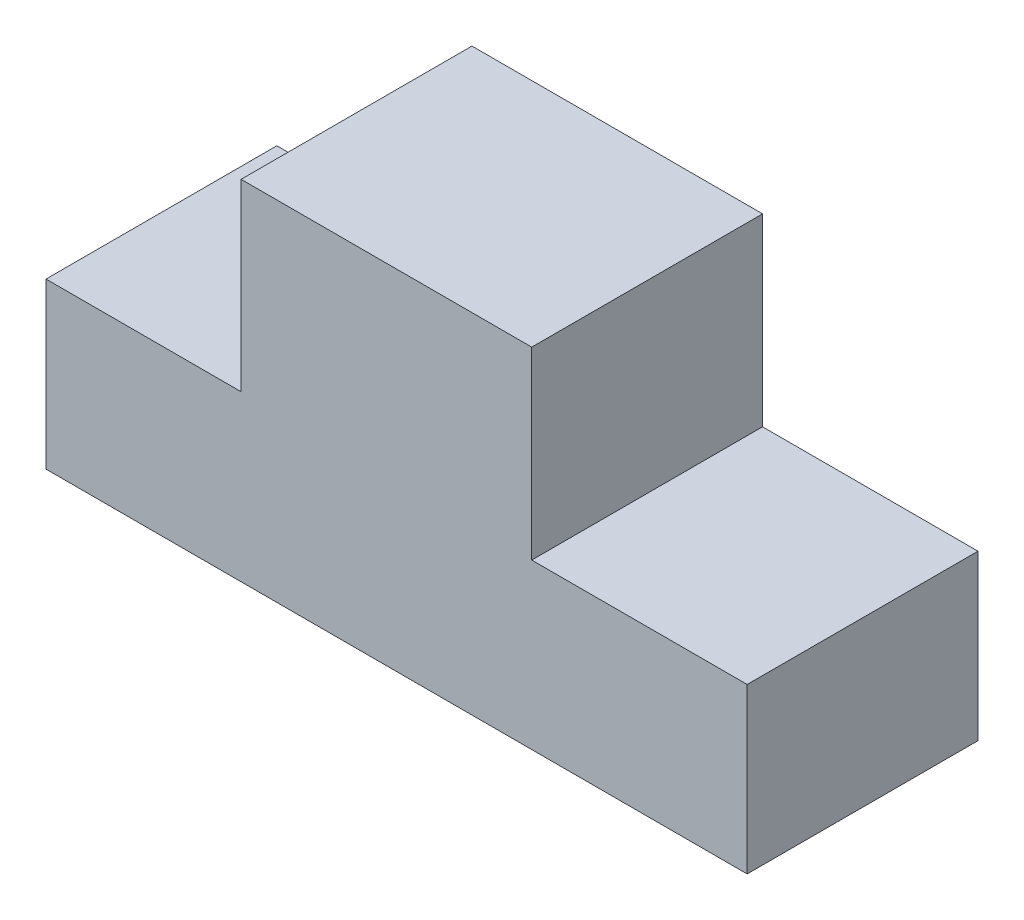
ISO-10303-21;
HEADER;
FILE_DESCRIPTION(('STEP AP214'),'2;1');
FILE_NAME('part.step','',(''),(''),'','','');
FILE_SCHEMA(('AUTOMOTIVE_DESIGN { 1 0 10303 214 1 1 1 1 }'));
ENDSEC;
DATA;
#1=APPLICATION_CONTEXT('core data for automotive mechanical design processes');
#2=APPLICATION_PROTOCOL_DEFINITION('international standard','automotive_design',2000,#1);
#3=PRODUCT_CONTEXT('',#1,'mechanical');
#4=PRODUCT('Part','Part','',(#3));
#5=PRODUCT_RELATED_PRODUCT_CATEGORY('part','',(#4));
#6=PRODUCT_DEFINITION_FORMATION('','',#4);
#7=PRODUCT_DEFINITION_CONTEXT('part definition',#1,'design');
#8=PRODUCT_DEFINITION('design','',#6,#7);
#9=PRODUCT_DEFINITION_SHAPE('','',#8);
#10=(LENGTH_UNIT() NAMED_UNIT(*) SI_UNIT(.MILLI.,.METRE.));
#11=(NAMED_UNIT(*) PLANE_ANGLE_UNIT() SI_UNIT($,.RADIAN.));
#12=(NAMED_UNIT(*) SI_UNIT($,.STERADIAN.) SOLID_ANGLE_UNIT());
#13=UNCERTAINTY_MEASURE_WITH_UNIT(LENGTH_MEASURE(1.E-05),#10,'distance_accuracy_value','');
#14=(GEOMETRIC_REPRESENTATION_CONTEXT(3) GLOBAL_UNCERTAINTY_ASSIGNED_CONTEXT((#13)) GLOBAL_UNIT_ASSIGNED_CONTEXT((#10,
#11,#12)) REPRESENTATION_CONTEXT('',''));
#15=CARTESIAN_POINT('',(0.,0.,0.));
#16=DIRECTION('',(0.,0.,1.));
#17=DIRECTION('',(1.,0.,0.));
#18=AXIS2_PLACEMENT_3D('',#15,#16,#17);
#19=CARTESIAN_POINT('',(-58.1282685180095,0.187088388214907,85.));
#20=DIRECTION('',(1.,0.,0.));
#21=DIRECTION('',(0.,0.,-1.));
#22=AXIS2_PLACEMENT_3D('',#19,#20,#21);
#23=PLANE('',#22);
#24=DIRECTION('',(0.,-1.,0.));
#25=VECTOR('',#24,1.);
#26=CARTESIAN_POINT('',(-58.1282685180095,0.187088388214907,0.));
#27=LINE('',#26,#25);
#28=CARTESIAN_POINT('',(-58.1282685180095,67.9130849220104,0.));
#29=VERTEX_POINT('',#28);
#30=CARTESIAN_POINT('',(-58.1282685180095,0.187088388214907,0.));
#31=VERTEX_POINT('',#30);
#32=EDGE_CURVE('E140',#29,#31,#27,.T.);
#33=ORIENTED_EDGE('',*,*,#32,.T.);
#34=DIRECTION('',(0.,0.,-1.));
#35=VECTOR('',#34,1.);
#36=CARTESIAN_POINT('',(-58.1282685180095,0.187088388214907,85.));
#37=LINE('',#36,#35);
#38=CARTESIAN_POINT('',(-58.1282685180095,0.187088388214907,85.));
#39=VERTEX_POINT('',#38);
#40=EDGE_CURVE('E11',#39,#31,#37,.T.);
#41=ORIENTED_EDGE('',*,*,#40,.F.);
#42=DIRECTION('',(0.,-1.,0.));
#43=VECTOR('',#42,1.);
#44=CARTESIAN_POINT('',(-58.1282685180095,0.187088388214907,85.));
#45=LINE('',#44,#43);
#46=CARTESIAN_POINT('',(-58.1282685180095,67.9130849220104,85.));
#47=VERTEX_POINT('',#46);
#48=EDGE_CURVE('E163',#47,#39,#45,.T.);
#49=ORIENTED_EDGE('',*,*,#48,.F.);
#50=DIRECTION('',(0.,0.,-1.));
#51=VECTOR('',#50,1.);
#52=CARTESIAN_POINT('',(-58.1282685180095,67.9130849220104,85.));
#53=LINE('',#52,#51);
#54=EDGE_CURVE('E136',#47,#29,#53,.T.);
#55=ORIENTED_EDGE('',*,*,#54,.T.);
#56=EDGE_LOOP('',(#33,#41,#49,#55));
#57=FACE_BOUND('',#56,.T.);
#58=ADVANCED_FACE('F39',(#57),#23,.F.);
#59=CARTESIAN_POINT('',(-129.970209592533,0.187088388214907,85.));
#60=DIRECTION('',(0.,-1.,0.));
#61=DIRECTION('',(0.,0.,-1.));
#62=AXIS2_PLACEMENT_3D('',#59,#60,#61);
#63=PLANE('',#62);
#64=DIRECTION('',(-1.,0.,0.));
#65=VECTOR('',#64,1.);
#66=CARTESIAN_POINT('',(-129.970209592533,0.187088388214907,0.));
#67=LINE('',#66,#65);
#68=CARTESIAN_POINT('',(-129.970209592533,0.187088388214907,0.));
#69=VERTEX_POINT('',#68);
#70=EDGE_CURVE('E144',#31,#69,#67,.T.);
#71=ORIENTED_EDGE('',*,*,#70,.T.);
#72=DIRECTION('',(0.,0.,-1.));
#73=VECTOR('',#72,1.);
#74=CARTESIAN_POINT('',(-129.970209592533,0.187088388214907,85.));
#75=LINE('',#74,#73);
#76=CARTESIAN_POINT('',(-129.970209592533,0.187088388214907,85.));
#77=VERTEX_POINT('',#76);
#78=EDGE_CURVE('E48',#77,#69,#75,.T.);
#79=ORIENTED_EDGE('',*,*,#78,.F.);
#80=DIRECTION('',(-1.,0.,0.));
#81=VECTOR('',#80,1.);
#82=CARTESIAN_POINT('',(-129.970209592533,0.187088388214907,85.));
#83=LINE('',#82,#81);
#84=EDGE_CURVE('E99',#39,#77,#83,.T.);
#85=ORIENTED_EDGE('',*,*,#84,.F.);
#86=ORIENTED_EDGE('',*,*,#40,.T.);
#87=EDGE_LOOP('',(#71,#79,#85,#86));
#88=FACE_BOUND('',#87,.T.);
#89=ADVANCED_FACE('F208',(#88),#63,.F.);
#90=CARTESIAN_POINT('',(-129.970209592533,-60.4295493934142,85.));
#91=DIRECTION('',(1.,0.,0.));
#92=DIRECTION('',(0.,0.,-1.));
#93=AXIS2_PLACEMENT_3D('',#90,#91,#92);
#94=PLANE('',#93);
#95=DIRECTION('',(0.,-1.,0.));
#96=VECTOR('',#95,1.);
#97=CARTESIAN_POINT('',(-129.970209592533,-60.4295493934142,0.));
#98=LINE('',#97,#96);
#99=CARTESIAN_POINT('',(-129.970209592533,-60.4295493934142,0.));
#100=VERTEX_POINT('',#99);
#101=EDGE_CURVE('E147',#69,#100,#98,.T.);
#102=ORIENTED_EDGE('',*,*,#101,.T.);
#103=DIRECTION('',(0.,0.,-1.));
#104=VECTOR('',#103,1.);
#105=CARTESIAN_POINT('',(-129.970209592533,-60.4295493934142,85.));
#106=LINE('',#105,#104);
#107=CARTESIAN_POINT('',(-129.970209592533,-60.4295493934142,85.));
#108=VERTEX_POINT('',#107);
#109=EDGE_CURVE('E174',#108,#100,#106,.T.);
#110=ORIENTED_EDGE('',*,*,#109,.F.);
#111=DIRECTION('',(0.,-1.,0.));
#112=VECTOR('',#111,1.);
#113=CARTESIAN_POINT('',(-129.970209592533,-60.4295493934142,85.));
#114=LINE('',#113,#112);
#115=EDGE_CURVE('E184',#77,#108,#114,.T.);
#116=ORIENTED_EDGE('',*,*,#115,.F.);
#117=ORIENTED_EDGE('',*,*,#78,.T.);
#118=EDGE_LOOP('',(#102,#110,#116,#117));
#119=FACE_BOUND('',#118,.T.);
#120=ADVANCED_FACE('F182',(#119),#94,.F.);
#121=CARTESIAN_POINT('',(128.211766144036,-60.4295493934142,85.));
#122=DIRECTION('',(0.,1.,0.));
#123=DIRECTION('',(-1.,0.,0.));
#124=AXIS2_PLACEMENT_3D('',#121,#122,#123);
#125=PLANE('',#124);
#126=DIRECTION('',(1.,0.,0.));
#127=VECTOR('',#126,1.);
#128=CARTESIAN_POINT('',(128.211766144036,-60.4295493934142,0.));
#129=LINE('',#128,#127);
#130=CARTESIAN_POINT('',(128.211766144036,-60.4295493934142,0.));
#131=VERTEX_POINT('',#130);
#132=EDGE_CURVE('E151',#100,#131,#129,.T.);
#133=ORIENTED_EDGE('',*,*,#132,.T.);
#134=DIRECTION('',(0.,0.,-1.));
#135=VECTOR('',#134,1.);
#136=CARTESIAN_POINT('',(128.211766144036,-60.4295493934142,85.));
#137=LINE('',#136,#135);
#138=CARTESIAN_POINT('',(128.211766144036,-60.4295493934142,85.));
#139=VERTEX_POINT('',#138);
#140=EDGE_CURVE('E170',#139,#131,#137,.T.);
#141=ORIENTED_EDGE('',*,*,#140,.F.);
#142=DIRECTION('',(1.,0.,0.));
#143=VECTOR('',#142,1.);
#144=CARTESIAN_POINT('',(-37.1743690379402,-60.4295493934142,85.));
#145=LINE('',#144,#143);
#146=EDGE_CURVE('E196',#108,#139,#145,.T.);
#147=ORIENTED_EDGE('',*,*,#146,.F.);
#148=ORIENTED_EDGE('',*,*,#109,.T.);
#149=EDGE_LOOP('',(#133,#141,#147,#148));
#150=FACE_BOUND('',#149,.T.);
#151=ADVANCED_FACE('F191',(#150),#125,.F.);
#152=CARTESIAN_POINT('',(128.211766144036,0.,85.));
#153=DIRECTION('',(-1.,0.,0.));
#154=DIRECTION('',(0.,0.,1.));
#155=AXIS2_PLACEMENT_3D('',#152,#153,#154);
#156=PLANE('',#155);
#157=DIRECTION('',(0.,1.,0.));
#158=VECTOR('',#157,1.);
#159=CARTESIAN_POINT('',(128.211766144036,0.,0.));
#160=LINE('',#159,#158);
#161=CARTESIAN_POINT('',(128.211766144036,0.,0.));
#162=VERTEX_POINT('',#161);
#163=EDGE_CURVE('E154',#131,#162,#160,.T.);
#164=ORIENTED_EDGE('',*,*,#163,.T.);
#165=DIRECTION('',(0.,0.,-1.));
#166=VECTOR('',#165,1.);
#167=CARTESIAN_POINT('',(128.211766144036,0.,85.));
#168=LINE('',#167,#166);
#169=CARTESIAN_POINT('',(128.211766144036,0.,85.));
#170=VERTEX_POINT('',#169);
#171=EDGE_CURVE('E129',#170,#162,#168,.T.);
#172=ORIENTED_EDGE('',*,*,#171,.F.);
#173=DIRECTION('',(0.,1.,0.));
#174=VECTOR('',#173,1.);
#175=CARTESIAN_POINT('',(128.211766144036,0.,85.));
#176=LINE('',#175,#174);
#177=EDGE_CURVE('E118',#139,#170,#176,.T.);
#178=ORIENTED_EDGE('',*,*,#177,.F.);
#179=ORIENTED_EDGE('',*,*,#140,.T.);
#180=EDGE_LOOP('',(#164,#172,#178,#179));
#181=FACE_BOUND('',#180,.T.);
#182=ADVANCED_FACE('F194',(#181),#156,.F.);
#183=CARTESIAN_POINT('',(48.886289540916,0.,85.));
#184=DIRECTION('',(0.,-1.,0.));
#185=DIRECTION('',(1.,0.,0.));
#186=AXIS2_PLACEMENT_3D('',#183,#184,#185);
#187=PLANE('',#186);
#188=DIRECTION('',(-1.,0.,0.));
#189=VECTOR('',#188,1.);
#190=CARTESIAN_POINT('',(48.886289540916,0.,0.));
#191=LINE('',#190,#189);
#192=CARTESIAN_POINT('',(48.886289540916,0.,0.));
#193=VERTEX_POINT('',#192);
#194=EDGE_CURVE('E127',#162,#193,#191,.T.);
#195=ORIENTED_EDGE('',*,*,#194,.T.);
#196=DIRECTION('',(0.,0.,-1.));
#197=VECTOR('',#196,1.);
#198=CARTESIAN_POINT('',(48.886289540916,0.,85.));
#199=LINE('',#198,#197);
#200=CARTESIAN_POINT('',(48.886289540916,0.,85.));
#201=VERTEX_POINT('',#200);
#202=EDGE_CURVE('E124',#201,#193,#199,.T.);
#203=ORIENTED_EDGE('',*,*,#202,.F.);
#204=DIRECTION('',(-1.,0.,0.));
#205=VECTOR('',#204,1.);
#206=CARTESIAN_POINT('',(48.886289540916,0.,85.));
#207=LINE('',#206,#205);
#208=EDGE_CURVE('E112',#170,#201,#207,.T.);
#209=ORIENTED_EDGE('',*,*,#208,.F.);
#210=ORIENTED_EDGE('',*,*,#171,.T.);
#211=EDGE_LOOP('',(#195,#203,#209,#210));
#212=FACE_BOUND('',#211,.T.);
#213=ADVANCED_FACE('F125',(#212),#187,.F.);
#214=CARTESIAN_POINT('',(48.886289540916,67.9130849220104,85.));
#215=DIRECTION('',(-1.,0.,0.));
#216=DIRECTION('',(0.,-1.,0.));
#217=AXIS2_PLACEMENT_3D('',#214,#215,#216);
#218=PLANE('',#217);
#219=DIRECTION('',(0.,1.,0.));
#220=VECTOR('',#219,1.);
#221=CARTESIAN_POINT('',(48.886289540916,67.9130849220104,0.));
#222=LINE('',#221,#220);
#223=CARTESIAN_POINT('',(48.886289540916,67.9130849220104,0.));
#224=VERTEX_POINT('',#223);
#225=EDGE_CURVE('E85',#193,#224,#222,.T.);
#226=ORIENTED_EDGE('',*,*,#225,.T.);
#227=DIRECTION('',(0.,0.,-1.));
#228=VECTOR('',#227,1.);
#229=CARTESIAN_POINT('',(48.886289540916,67.9130849220104,85.));
#230=LINE('',#229,#228);
#231=CARTESIAN_POINT('',(48.886289540916,67.9130849220104,85.));
#232=VERTEX_POINT('',#231);
#233=EDGE_CURVE('E130',#232,#224,#230,.T.);
#234=ORIENTED_EDGE('',*,*,#233,.F.);
#235=DIRECTION('',(0.,1.,0.));
#236=VECTOR('',#235,1.);
#237=CARTESIAN_POINT('',(48.886289540916,67.9130849220104,85.));
#238=LINE('',#237,#236);
#239=EDGE_CURVE('E116',#201,#232,#238,.T.);
#240=ORIENTED_EDGE('',*,*,#239,.F.);
#241=ORIENTED_EDGE('',*,*,#202,.T.);
#242=EDGE_LOOP('',(#226,#234,#240,#241));
#243=FACE_BOUND('',#242,.T.);
#244=ADVANCED_FACE('F132',(#243),#218,.F.);
#245=CARTESIAN_POINT('',(-58.1282685180095,67.9130849220104,85.));
#246=DIRECTION('',(0.,-1.,0.));
#247=DIRECTION('',(0.,0.,-1.));
#248=AXIS2_PLACEMENT_3D('',#245,#246,#247);
#249=PLANE('',#248);
#250=DIRECTION('',(-1.,0.,0.));
#251=VECTOR('',#250,1.);
#252=CARTESIAN_POINT('',(-58.1282685180095,67.9130849220104,0.));
#253=LINE('',#252,#251);
#254=EDGE_CURVE('E91',#224,#29,#253,.T.);
#255=ORIENTED_EDGE('',*,*,#254,.T.);
#256=ORIENTED_EDGE('',*,*,#54,.F.);
#257=DIRECTION('',(-1.,0.,0.));
#258=VECTOR('',#257,1.);
#259=CARTESIAN_POINT('',(-58.1282685180095,67.9130849220104,85.));
#260=LINE('',#259,#258);
#261=EDGE_CURVE('E56',#232,#47,#260,.T.);
#262=ORIENTED_EDGE('',*,*,#261,.F.);
#263=ORIENTED_EDGE('',*,*,#233,.T.);
#264=EDGE_LOOP('',(#255,#256,#262,#263));
#265=FACE_BOUND('',#264,.T.);
#266=ADVANCED_FACE('F224',(#265),#249,.F.);
#267=CARTESIAN_POINT('',(0.,0.,85.));
#268=DIRECTION('',(0.,0.,-1.));
#269=DIRECTION('',(-1.,0.,0.));
#270=AXIS2_PLACEMENT_3D('',#267,#268,#269);
#271=PLANE('',#270);
#272=ORIENTED_EDGE('',*,*,#48,.T.);
#273=ORIENTED_EDGE('',*,*,#84,.T.);
#274=ORIENTED_EDGE('',*,*,#115,.T.);
#275=ORIENTED_EDGE('',*,*,#146,.T.);
#276=ORIENTED_EDGE('',*,*,#177,.T.);
#277=ORIENTED_EDGE('',*,*,#208,.T.);
#278=ORIENTED_EDGE('',*,*,#239,.T.);
#279=ORIENTED_EDGE('',*,*,#261,.T.);
#280=EDGE_LOOP('',(#272,#273,#274,#275,#276,#277,#278,#279));
#281=FACE_BOUND('',#280,.T.);
#282=ADVANCED_FACE('F114',(#281),#271,.F.);
#283=CARTESIAN_POINT('',(0.,0.,0.));
#284=DIRECTION('',(0.,0.,-1.));
#285=DIRECTION('',(-1.,0.,0.));
#286=AXIS2_PLACEMENT_3D('',#283,#284,#285);
#287=PLANE('',#286);
#288=ORIENTED_EDGE('',*,*,#32,.F.);
#289=ORIENTED_EDGE('',*,*,#254,.F.);
#290=ORIENTED_EDGE('',*,*,#225,.F.);
#291=ORIENTED_EDGE('',*,*,#194,.F.);
#292=ORIENTED_EDGE('',*,*,#163,.F.);
#293=ORIENTED_EDGE('',*,*,#132,.F.);
#294=ORIENTED_EDGE('',*,*,#101,.F.);
#295=ORIENTED_EDGE('',*,*,#70,.F.);
#296=EDGE_LOOP('',(#288,#289,#290,#291,#292,#293,#294,#295));
#297=FACE_BOUND('',#296,.T.);
#298=ADVANCED_FACE('F187',(#297),#287,.T.);
#299=CLOSED_SHELL('',(#58,#89,#120,#151,#182,#213,#244,#266,#282,#298));
#300=MANIFOLD_SOLID_BREP('B2',#299);
#301=ADVANCED_BREP_SHAPE_REPRESENTATION('',(#18,#300),#14);
#302=SHAPE_DEFINITION_REPRESENTATION(#9,#301);
ENDSEC;
END-ISO-10303-21;
